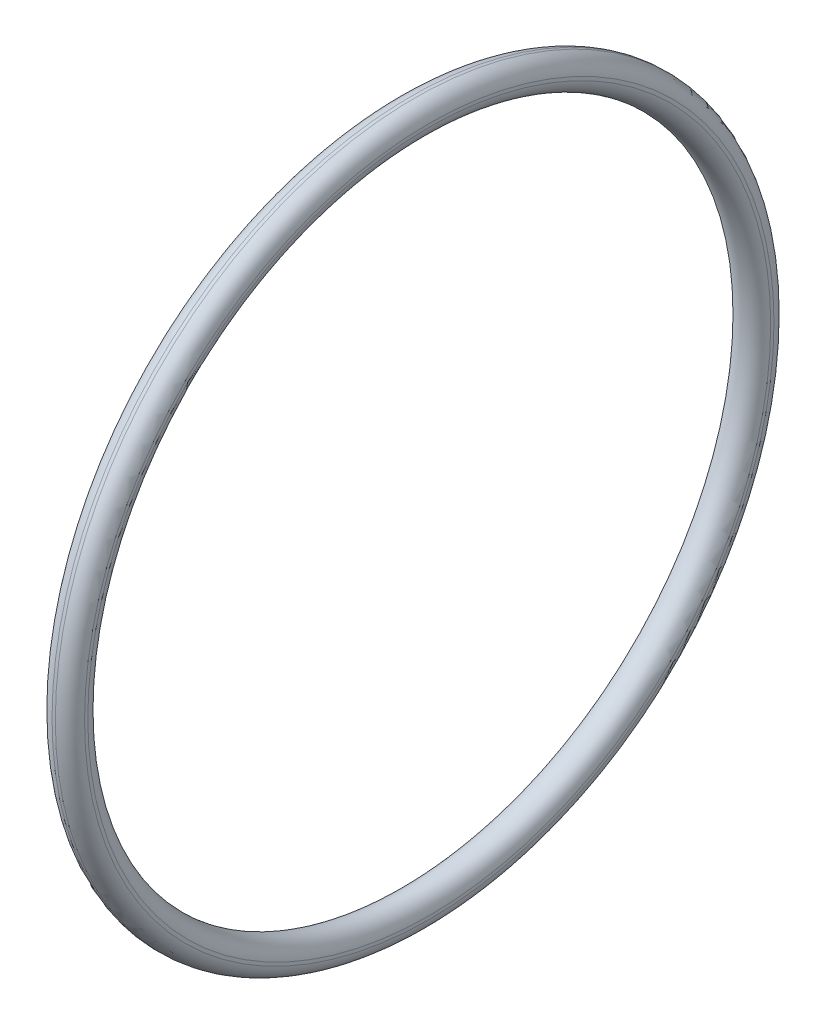
ISO-10303-21;
HEADER;
FILE_DESCRIPTION(('STEP AP214'),'2;1');
FILE_NAME('part.step','',(''),(''),'','','');
FILE_SCHEMA(('AUTOMOTIVE_DESIGN { 1 0 10303 214 1 1 1 1 }'));
ENDSEC;
DATA;
#1=APPLICATION_CONTEXT('core data for automotive mechanical design processes');
#2=APPLICATION_PROTOCOL_DEFINITION('international standard','automotive_design',2000,#1);
#3=PRODUCT_CONTEXT('',#1,'mechanical');
#4=PRODUCT('Part','Part','',(#3));
#5=PRODUCT_RELATED_PRODUCT_CATEGORY('part','',(#4));
#6=PRODUCT_DEFINITION_FORMATION('','',#4);
#7=PRODUCT_DEFINITION_CONTEXT('part definition',#1,'design');
#8=PRODUCT_DEFINITION('design','',#6,#7);
#9=PRODUCT_DEFINITION_SHAPE('','',#8);
#10=(LENGTH_UNIT() NAMED_UNIT(*) SI_UNIT(.MILLI.,.METRE.));
#11=(NAMED_UNIT(*) PLANE_ANGLE_UNIT() SI_UNIT($,.RADIAN.));
#12=(NAMED_UNIT(*) SI_UNIT($,.STERADIAN.) SOLID_ANGLE_UNIT());
#13=UNCERTAINTY_MEASURE_WITH_UNIT(LENGTH_MEASURE(1.E-05),#10,'distance_accuracy_value','');
#14=(GEOMETRIC_REPRESENTATION_CONTEXT(3) GLOBAL_UNCERTAINTY_ASSIGNED_CONTEXT((#13)) GLOBAL_UNIT_ASSIGNED_CONTEXT((#10,
#11,#12)) REPRESENTATION_CONTEXT('',''));
#15=CARTESIAN_POINT('',(0.,0.,0.));
#16=DIRECTION('',(0.,0.,1.));
#17=DIRECTION('',(1.,0.,0.));
#18=AXIS2_PLACEMENT_3D('',#15,#16,#17);
#19=CARTESIAN_POINT('',(0.,0.,0.));
#20=DIRECTION('',(-1.,0.,0.));
#21=DIRECTION('',(0.,0.,1.));
#22=AXIS2_PLACEMENT_3D('',#19,#20,#21);
#23=TOROIDAL_SURFACE('',#22,42.,2.);
#24=CARTESIAN_POINT('',(1.98997487421324,0.,0.));
#25=DIRECTION('',(-1.,0.,0.));
#26=DIRECTION('',(0.,0.,1.));
#27=AXIS2_PLACEMENT_3D('',#24,#25,#26);
#28=CIRCLE('',#27,41.8);
#29=CARTESIAN_POINT('',(1.98997487421324,0.,41.8));
#30=VERTEX_POINT('',#29);
#31=EDGE_CURVE('E10',#30,#30,#28,.T.);
#32=ORIENTED_EDGE('',*,*,#31,.F.);
#33=EDGE_LOOP('',(#32));
#34=FACE_BOUND('',#33,.T.);
#35=CARTESIAN_POINT('',(-0.2,0.,0.));
#36=DIRECTION('',(-1.,0.,0.));
#37=DIRECTION('',(0.,0.,1.));
#38=AXIS2_PLACEMENT_3D('',#35,#36,#37);
#39=CIRCLE('',#38,43.9899748742132);
#40=CARTESIAN_POINT('',(-0.2,0.,43.9899748742132));
#41=VERTEX_POINT('',#40);
#42=EDGE_CURVE('E46',#41,#41,#39,.T.);
#43=ORIENTED_EDGE('',*,*,#42,.T.);
#44=EDGE_LOOP('',(#43));
#45=FACE_BOUND('',#44,.T.);
#46=ADVANCED_FACE('F32',(#34,#45),#23,.T.);
#47=CARTESIAN_POINT('',(1.98997487421324,41.8,0.));
#48=DIRECTION('',(-1.,0.,0.));
#49=DIRECTION('',(0.,0.,1.));
#50=AXIS2_PLACEMENT_3D('',#47,#48,#49);
#51=PLANE('',#50);
#52=CARTESIAN_POINT('',(1.98997487421324,0.,0.));
#53=DIRECTION('',(-1.,0.,0.));
#54=DIRECTION('',(0.,0.,1.));
#55=AXIS2_PLACEMENT_3D('',#52,#53,#54);
#56=CIRCLE('',#55,42.2);
#57=CARTESIAN_POINT('',(1.98997487421324,0.,42.2));
#58=VERTEX_POINT('',#57);
#59=EDGE_CURVE('E38',#58,#58,#56,.T.);
#60=ORIENTED_EDGE('',*,*,#59,.F.);
#61=EDGE_LOOP('',(#60));
#62=FACE_BOUND('',#61,.T.);
#63=ORIENTED_EDGE('',*,*,#31,.T.);
#64=EDGE_LOOP('',(#63));
#65=FACE_BOUND('',#64,.T.);
#66=ADVANCED_FACE('F61',(#62,#65),#51,.F.);
#67=CARTESIAN_POINT('',(0.,0.,0.));
#68=DIRECTION('',(-1.,0.,0.));
#69=DIRECTION('',(0.,0.,1.));
#70=AXIS2_PLACEMENT_3D('',#67,#68,#69);
#71=TOROIDAL_SURFACE('',#70,42.,2.);
#72=CARTESIAN_POINT('',(0.2,0.,0.));
#73=DIRECTION('',(-1.,0.,0.));
#74=DIRECTION('',(0.,0.,1.));
#75=AXIS2_PLACEMENT_3D('',#72,#73,#74);
#76=CIRCLE('',#75,43.9899748742132);
#77=CARTESIAN_POINT('',(0.2,0.,43.9899748742132));
#78=VERTEX_POINT('',#77);
#79=EDGE_CURVE('E42',#78,#78,#76,.T.);
#80=ORIENTED_EDGE('',*,*,#79,.F.);
#81=EDGE_LOOP('',(#80));
#82=FACE_BOUND('',#81,.T.);
#83=ORIENTED_EDGE('',*,*,#59,.T.);
#84=EDGE_LOOP('',(#83));
#85=FACE_BOUND('',#84,.T.);
#86=ADVANCED_FACE('F56',(#82,#85),#71,.T.);
#87=CARTESIAN_POINT('',(0.,0.,0.));
#88=DIRECTION('',(-1.,0.,0.));
#89=DIRECTION('',(0.,0.,1.));
#90=AXIS2_PLACEMENT_3D('',#87,#88,#89);
#91=CYLINDRICAL_SURFACE('',#90,43.9899748742132);
#92=ORIENTED_EDGE('',*,*,#42,.F.);
#93=EDGE_LOOP('',(#92));
#94=FACE_BOUND('',#93,.T.);
#95=ORIENTED_EDGE('',*,*,#79,.T.);
#96=EDGE_LOOP('',(#95));
#97=FACE_BOUND('',#96,.T.);
#98=ADVANCED_FACE('F53',(#94,#97),#91,.T.);
#99=CLOSED_SHELL('',(#46,#66,#86,#98));
#100=MANIFOLD_SOLID_BREP('B2',#99);
#101=ADVANCED_BREP_SHAPE_REPRESENTATION('',(#18,#100),#14);
#102=SHAPE_DEFINITION_REPRESENTATION(#9,#101);
ENDSEC;
END-ISO-10303-21;
